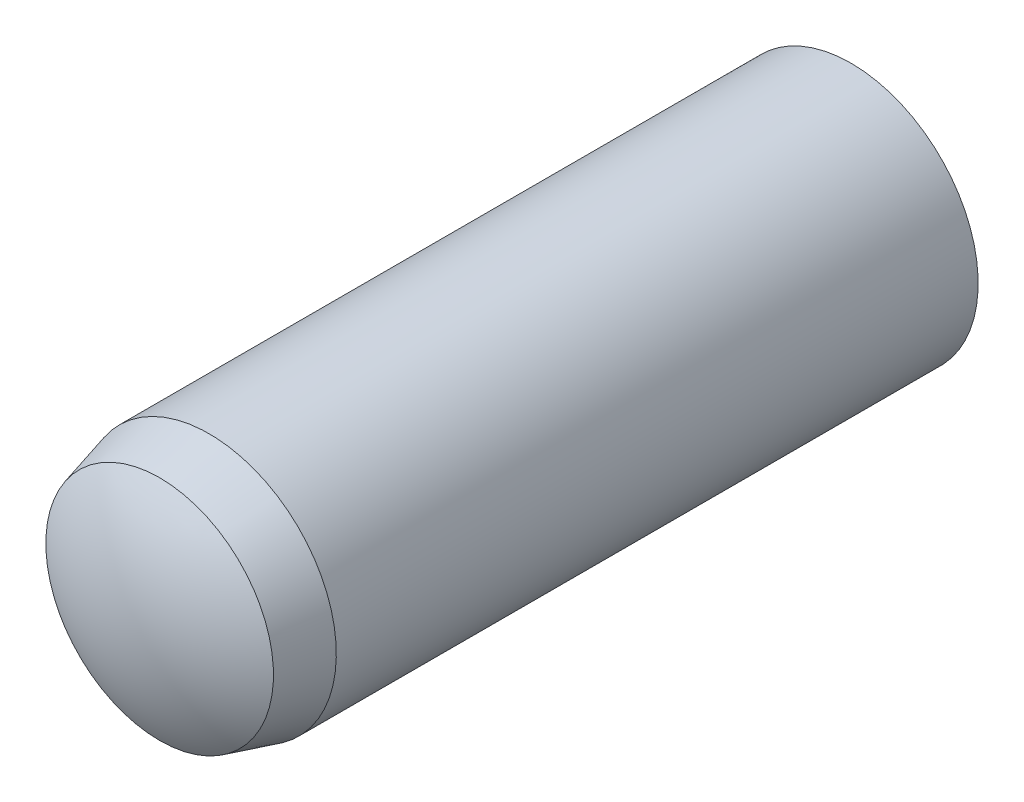
ISO-10303-21;
HEADER;
FILE_DESCRIPTION(('STEP AP214'),'2;1');
FILE_NAME('part.step','',(''),(''),'','','');
FILE_SCHEMA(('AUTOMOTIVE_DESIGN { 1 0 10303 214 1 1 1 1 }'));
ENDSEC;
DATA;
#1=APPLICATION_CONTEXT('core data for automotive mechanical design processes');
#2=APPLICATION_PROTOCOL_DEFINITION('international standard','automotive_design',2000,#1);
#3=PRODUCT_CONTEXT('',#1,'mechanical');
#4=PRODUCT('Part','Part','',(#3));
#5=PRODUCT_RELATED_PRODUCT_CATEGORY('part','',(#4));
#6=PRODUCT_DEFINITION_FORMATION('','',#4);
#7=PRODUCT_DEFINITION_CONTEXT('part definition',#1,'design');
#8=PRODUCT_DEFINITION('design','',#6,#7);
#9=PRODUCT_DEFINITION_SHAPE('','',#8);
#10=(LENGTH_UNIT() NAMED_UNIT(*) SI_UNIT(.MILLI.,.METRE.));
#11=(NAMED_UNIT(*) PLANE_ANGLE_UNIT() SI_UNIT($,.RADIAN.));
#12=(NAMED_UNIT(*) SI_UNIT($,.STERADIAN.) SOLID_ANGLE_UNIT());
#13=UNCERTAINTY_MEASURE_WITH_UNIT(LENGTH_MEASURE(1.E-05),#10,'distance_accuracy_value','');
#14=(GEOMETRIC_REPRESENTATION_CONTEXT(3) GLOBAL_UNCERTAINTY_ASSIGNED_CONTEXT((#13)) GLOBAL_UNIT_ASSIGNED_CONTEXT((#10,
#11,#12)) REPRESENTATION_CONTEXT('',''));
#15=CARTESIAN_POINT('',(0.,0.,0.));
#16=DIRECTION('',(0.,0.,1.));
#17=DIRECTION('',(1.,0.,0.));
#18=AXIS2_PLACEMENT_3D('',#15,#16,#17);
#19=CARTESIAN_POINT('',(0.,0.,-1.18333333333333));
#20=DIRECTION('',(0.,0.,1.));
#21=DIRECTION('',(0.,1.,0.));
#22=AXIS2_PLACEMENT_3D('',#19,#20,#21);
#23=SPHERICAL_SURFACE('',#22,1.81666666666667);
#24=CARTESIAN_POINT('',(0.,0.,-2.7));
#25=DIRECTION('',(0.,0.,1.));
#26=DIRECTION('',(0.,-1.,0.));
#27=AXIS2_PLACEMENT_3D('',#24,#25,#26);
#28=CIRCLE('',#27,0.999999999999999);
#29=CARTESIAN_POINT('',(0.,-0.999999999999999,-2.7));
#30=VERTEX_POINT('',#29);
#31=EDGE_CURVE('E10',#30,#30,#28,.T.);
#32=ORIENTED_EDGE('',*,*,#31,.F.);
#33=EDGE_LOOP('',(#32));
#34=FACE_BOUND('',#33,.T.);
#35=ADVANCED_FACE('F37',(#34),#23,.T.);
#36=CARTESIAN_POINT('',(0.,0.,3.));
#37=DIRECTION('',(0.,0.,1.));
#38=DIRECTION('',(0.,-1.,0.));
#39=AXIS2_PLACEMENT_3D('',#36,#37,#38);
#40=CYLINDRICAL_SURFACE('',#39,1.);
#41=CARTESIAN_POINT('',(0.,0.,2.35));
#42=DIRECTION('',(0.,0.,1.));
#43=DIRECTION('',(0.,-1.,0.));
#44=AXIS2_PLACEMENT_3D('',#41,#42,#43);
#45=CIRCLE('',#44,1.);
#46=CARTESIAN_POINT('',(0.,-1.,2.35));
#47=VERTEX_POINT('',#46);
#48=EDGE_CURVE('E43',#47,#47,#45,.T.);
#49=ORIENTED_EDGE('',*,*,#48,.F.);
#50=EDGE_LOOP('',(#49));
#51=FACE_BOUND('',#50,.T.);
#52=ORIENTED_EDGE('',*,*,#31,.T.);
#53=EDGE_LOOP('',(#52));
#54=FACE_BOUND('',#53,.T.);
#55=ADVANCED_FACE('F58',(#51,#54),#40,.T.);
#56=CARTESIAN_POINT('',(0.,0.,2.35));
#57=DIRECTION('',(0.,0.,-1.));
#58=DIRECTION('',(0.,1.,0.));
#59=AXIS2_PLACEMENT_3D('',#56,#57,#58);
#60=CONICAL_SURFACE('',#59,1.,0.26179938779915);
#61=CARTESIAN_POINT('',(0.,0.,2.74));
#62=DIRECTION('',(0.,0.,1.));
#63=DIRECTION('',(0.,-1.,0.));
#64=AXIS2_PLACEMENT_3D('',#61,#62,#63);
#65=CIRCLE('',#64,0.895499814951862);
#66=CARTESIAN_POINT('',(0.,-0.895499814951862,2.74));
#67=VERTEX_POINT('',#66);
#68=EDGE_CURVE('E47',#67,#67,#65,.T.);
#69=ORIENTED_EDGE('',*,*,#68,.F.);
#70=EDGE_LOOP('',(#69));
#71=FACE_BOUND('',#70,.T.);
#72=ORIENTED_EDGE('',*,*,#48,.T.);
#73=EDGE_LOOP('',(#72));
#74=FACE_BOUND('',#73,.T.);
#75=ADVANCED_FACE('F56',(#71,#74),#60,.T.);
#76=CARTESIAN_POINT('',(0.,0.,1.32784631042535));
#77=DIRECTION('',(0.,0.,1.));
#78=DIRECTION('',(0.,1.,0.));
#79=AXIS2_PLACEMENT_3D('',#76,#77,#78);
#80=SPHERICAL_SURFACE('',#79,1.67215368957465);
#81=ORIENTED_EDGE('',*,*,#68,.T.);
#82=EDGE_LOOP('',(#81));
#83=FACE_BOUND('',#82,.T.);
#84=ADVANCED_FACE('F54',(#83),#80,.T.);
#85=CLOSED_SHELL('',(#35,#55,#75,#84));
#86=MANIFOLD_SOLID_BREP('B2',#85);
#87=ADVANCED_BREP_SHAPE_REPRESENTATION('',(#18,#86),#14);
#88=SHAPE_DEFINITION_REPRESENTATION(#9,#87);
ENDSEC;
END-ISO-10303-21;
